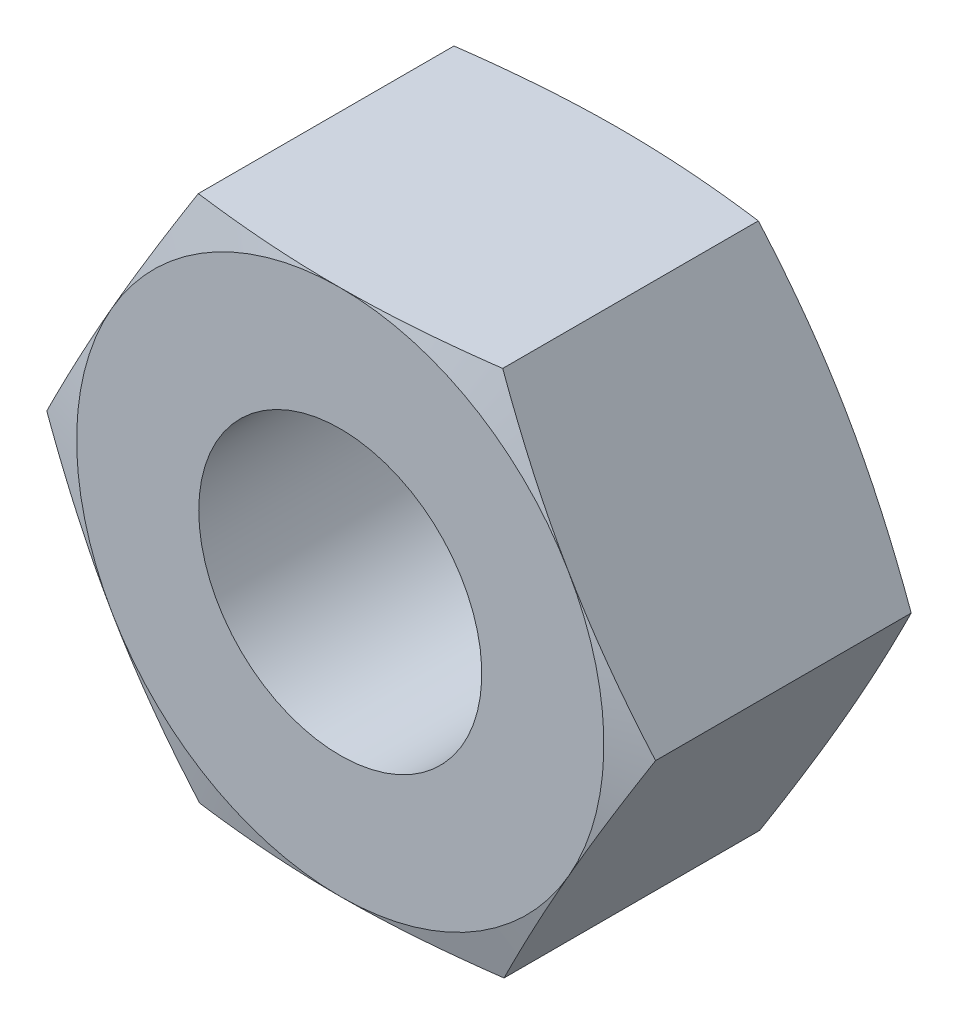
ISO-10303-21;
HEADER;
FILE_DESCRIPTION(('STEP AP214'),'2;1');
FILE_NAME('part.step','',(''),(''),'','','');
FILE_SCHEMA(('AUTOMOTIVE_DESIGN { 1 0 10303 214 1 1 1 1 }'));
ENDSEC;
DATA;
#1=APPLICATION_CONTEXT('core data for automotive mechanical design processes');
#2=APPLICATION_PROTOCOL_DEFINITION('international standard','automotive_design',2000,#1);
#3=PRODUCT_CONTEXT('',#1,'mechanical');
#4=PRODUCT('Part','Part','',(#3));
#5=PRODUCT_RELATED_PRODUCT_CATEGORY('part','',(#4));
#6=PRODUCT_DEFINITION_FORMATION('','',#4);
#7=PRODUCT_DEFINITION_CONTEXT('part definition',#1,'design');
#8=PRODUCT_DEFINITION('design','',#6,#7);
#9=PRODUCT_DEFINITION_SHAPE('','',#8);
#10=(LENGTH_UNIT() NAMED_UNIT(*) SI_UNIT(.MILLI.,.METRE.));
#11=(NAMED_UNIT(*) PLANE_ANGLE_UNIT() SI_UNIT($,.RADIAN.));
#12=(NAMED_UNIT(*) SI_UNIT($,.STERADIAN.) SOLID_ANGLE_UNIT());
#13=UNCERTAINTY_MEASURE_WITH_UNIT(LENGTH_MEASURE(1.E-05),#10,'distance_accuracy_value','');
#14=(GEOMETRIC_REPRESENTATION_CONTEXT(3) GLOBAL_UNCERTAINTY_ASSIGNED_CONTEXT((#13)) GLOBAL_UNIT_ASSIGNED_CONTEXT((#10,
#11,#12)) REPRESENTATION_CONTEXT('',''));
#15=CARTESIAN_POINT('',(0.,0.,0.));
#16=DIRECTION('',(0.,0.,1.));
#17=DIRECTION('',(1.,0.,0.));
#18=AXIS2_PLACEMENT_3D('',#15,#16,#17);
#19=CARTESIAN_POINT('',(0.,0.,0.));
#20=DIRECTION('',(0.,0.,1.));
#21=DIRECTION('',(1.,0.,0.));
#22=AXIS2_PLACEMENT_3D('',#19,#20,#21);
#23=PLANE('',#22);
#24=CARTESIAN_POINT('',(0.,0.,0.));
#25=DIRECTION('',(0.,0.,1.));
#26=DIRECTION('',(1.,0.,0.));
#27=AXIS2_PLACEMENT_3D('',#24,#25,#26);
#28=CIRCLE('',#27,9.5);
#29=CARTESIAN_POINT('',(8.21503441048256,4.77108055209586,0.));
#30=VERTEX_POINT('',#29);
#31=CARTESIAN_POINT('',(-0.0243597563756183,9.49996876848915,0.));
#32=VERTEX_POINT('',#31);
#33=EDGE_CURVE('E14',#30,#32,#28,.T.);
#34=ORIENTED_EDGE('',*,*,#33,.F.);
#35=CARTESIAN_POINT('',(8.23939416685818,-4.72888821639329,0.));
#36=VERTEX_POINT('',#35);
#37=EDGE_CURVE('E57',#36,#30,#28,.T.);
#38=ORIENTED_EDGE('',*,*,#37,.F.);
#39=CARTESIAN_POINT('',(0.0243597563756183,-9.49996876848915,0.));
#40=VERTEX_POINT('',#39);
#41=EDGE_CURVE('E164',#40,#36,#28,.T.);
#42=ORIENTED_EDGE('',*,*,#41,.F.);
#43=CARTESIAN_POINT('',(-8.21503441048256,-4.77108055209586,0.));
#44=VERTEX_POINT('',#43);
#45=EDGE_CURVE('E514',#44,#40,#28,.T.);
#46=ORIENTED_EDGE('',*,*,#45,.F.);
#47=CARTESIAN_POINT('',(-8.23939416685818,4.72888821639329,0.));
#48=VERTEX_POINT('',#47);
#49=EDGE_CURVE('E62',#48,#44,#28,.T.);
#50=ORIENTED_EDGE('',*,*,#49,.F.);
#51=CARTESIAN_POINT('',(0.,0.,0.));
#52=DIRECTION('',(0.,0.,-1.));
#53=DIRECTION('',(-1.,0.,0.));
#54=AXIS2_PLACEMENT_3D('',#51,#52,#53);
#55=CIRCLE('',#54,9.5);
#56=EDGE_CURVE('E168',#48,#32,#55,.T.);
#57=ORIENTED_EDGE('',*,*,#56,.T.);
#58=EDGE_LOOP('',(#34,#38,#42,#46,#50,#57));
#59=FACE_BOUND('',#58,.T.);
#60=CARTESIAN_POINT('',(0.,0.,0.));
#61=DIRECTION('',(0.,0.,-1.));
#62=DIRECTION('',(-1.,0.,0.));
#63=AXIS2_PLACEMENT_3D('',#60,#61,#62);
#64=CIRCLE('',#63,5.09999999999999);
#65=CARTESIAN_POINT('',(-5.09999999999999,0.,0.));
#66=VERTEX_POINT('',#65);
#67=EDGE_CURVE('E510',#66,#66,#64,.T.);
#68=ORIENTED_EDGE('',*,*,#67,.F.);
#69=EDGE_LOOP('',(#68));
#70=FACE_BOUND('',#69,.T.);
#71=ADVANCED_FACE('F52',(#59,#70),#23,.F.);
#72=CARTESIAN_POINT('',(10.9696190515605,0.0281282238017145,10.));
#73=DIRECTION('',(-0.864740464261323,-0.502219005483775,0.));
#74=DIRECTION('',(0.502219005483775,-0.864740464261323,0.));
#75=AXIS2_PLACEMENT_3D('',#72,#73,#74);
#76=PLANE('',#75);
#77=CARTESIAN_POINT('',(5.46033361455211,9.51423288039001,0.393823887682442));
#78=CARTESIAN_POINT('',(5.68912520853793,9.12029050257854,0.332765207818984));
#79=CARTESIAN_POINT('',(5.9183316212733,8.72563387350588,0.277334050263684));
#80=CARTESIAN_POINT('',(6.37755388773269,7.93492688798528,0.179946762141715));
#81=CARTESIAN_POINT('',(6.607570031986,7.53887603129256,0.137996104584147));
#82=CARTESIAN_POINT('',(7.06701720696994,6.74778178941605,0.0700188148540026));
#83=CARTESIAN_POINT('',(7.29644513107949,6.35274375333477,0.0439111187775036));
#84=CARTESIAN_POINT('',(7.75559355042798,5.5621639206783,0.00890337590082054));
#85=CARTESIAN_POINT('',(7.98531398045527,5.16662223638708,0.));
#86=CARTESIAN_POINT('',(8.44475484050986,4.37553886780465,0.));
#87=CARTESIAN_POINT('',(8.67447527053715,3.97999718351343,0.00890337590082028));
#88=CARTESIAN_POINT('',(9.13362368988564,3.18941735085696,0.0439111187775033));
#89=CARTESIAN_POINT('',(9.36305161399519,2.79437931477567,0.0700188148540024));
#90=CARTESIAN_POINT('',(9.82249878897913,2.00328507289916,0.137996104584146));
#91=CARTESIAN_POINT('',(10.0525149332324,1.60723421620644,0.179946762141714));
#92=CARTESIAN_POINT('',(10.5117371996918,0.816527230685846,0.277334050263684));
#93=CARTESIAN_POINT('',(10.7409436124272,0.421870601613182,0.332765207818983));
#94=CARTESIAN_POINT('',(10.969735206413,0.0279282238017149,0.393823887682442));
#95=B_SPLINE_CURVE_WITH_KNOTS('',3,(#77,#78,#79,#80,#81,#82,#83,#84,#85,#86,#87,#88,#89,#90,#91,
#92,#93,#94),.UNSPECIFIED.,.F.,.F.,(4,2,2,2,2,2,2,2,4),(0.,1.37897730781453,2.75851376758056,
4.13093067092312,5.5030819798307,6.87523328873828,8.24765019208084,9.62718665184686,
11.0061639596614),.UNSPECIFIED.);
#96=CARTESIAN_POINT('',(5.46044976940463,9.51403288039001,0.393792901110109));
#97=VERTEX_POINT('',#96);
#98=EDGE_CURVE('E142',#97,#30,#95,.T.);
#99=ORIENTED_EDGE('',*,*,#98,.F.);
#100=DIRECTION('',(0.,0.,-1.));
#101=VECTOR('',#100,1.);
#102=CARTESIAN_POINT('',(5.46044976940463,9.51403288039001,10.));
#103=LINE('',#102,#101);
#104=CARTESIAN_POINT('',(5.46044976940463,9.51403288039001,9.60620709888989));
#105=VERTEX_POINT('',#104);
#106=EDGE_CURVE('E349',#105,#97,#103,.T.);
#107=ORIENTED_EDGE('',*,*,#106,.F.);
#108=CARTESIAN_POINT('',(10.969735206413,0.0279282238017145,9.60617611231756));
#109=CARTESIAN_POINT('',(10.7409436124272,0.421870601613182,9.66723479218101));
#110=CARTESIAN_POINT('',(10.5117371996918,0.816527230685846,9.72266594973631));
#111=CARTESIAN_POINT('',(10.0525149332324,1.60723421620644,9.82005323785829));
#112=CARTESIAN_POINT('',(9.82249878897913,2.00328507289916,9.86200389541585));
#113=CARTESIAN_POINT('',(9.36305161399519,2.79437931477567,9.929981185146));
#114=CARTESIAN_POINT('',(9.13362368988564,3.18941735085696,9.9560888812225));
#115=CARTESIAN_POINT('',(8.67447527053715,3.97999718351343,9.99109662409918));
#116=CARTESIAN_POINT('',(8.44475484050986,4.37553886780464,10.));
#117=CARTESIAN_POINT('',(7.98531398045527,5.16662223638708,10.));
#118=CARTESIAN_POINT('',(7.75559355042798,5.5621639206783,9.99109662409918));
#119=CARTESIAN_POINT('',(7.2964451310795,6.35274375333477,9.9560888812225));
#120=CARTESIAN_POINT('',(7.06701720696994,6.74778178941605,9.929981185146));
#121=CARTESIAN_POINT('',(6.607570031986,7.53887603129256,9.86200389541585));
#122=CARTESIAN_POINT('',(6.37755388773269,7.93492688798528,9.82005323785829));
#123=CARTESIAN_POINT('',(5.9183316212733,8.72563387350588,9.72266594973631));
#124=CARTESIAN_POINT('',(5.68912520853793,9.12029050257854,9.66723479218101));
#125=CARTESIAN_POINT('',(5.46033361455211,9.51423288039001,9.60617611231756));
#126=B_SPLINE_CURVE_WITH_KNOTS('',3,(#108,#109,#110,#111,#112,#113,#114,#115,#116,#117,#118,
#119,#120,#121,#122,#123,#124,#125),.UNSPECIFIED.,.F.,.F.,(4,2,2,2,2,2,2,2,4),(0.,
1.37897730781453,2.75851376758056,4.13093067092312,5.5030819798307,6.87523328873828,
8.24765019208084,9.62718665184686,11.0061639596614),.UNSPECIFIED.);
#127=CARTESIAN_POINT('',(8.21503441048256,4.77108055209586,10.));
#128=VERTEX_POINT('',#127);
#129=EDGE_CURVE('E317',#128,#105,#126,.T.);
#130=ORIENTED_EDGE('',*,*,#129,.F.);
#131=CARTESIAN_POINT('',(10.9696190515605,0.028128223801714,9.60620709888989));
#132=VERTEX_POINT('',#131);
#133=EDGE_CURVE('E354',#132,#128,#126,.T.);
#134=ORIENTED_EDGE('',*,*,#133,.F.);
#135=DIRECTION('',(0.,0.,-1.));
#136=VECTOR('',#135,1.);
#137=CARTESIAN_POINT('',(10.9696190515605,0.0281282238017145,10.));
#138=LINE('',#137,#136);
#139=CARTESIAN_POINT('',(10.9696190515605,0.0281282238017144,0.393792901110109));
#140=VERTEX_POINT('',#139);
#141=EDGE_CURVE('E172',#132,#140,#138,.T.);
#142=ORIENTED_EDGE('',*,*,#141,.T.);
#143=EDGE_CURVE('E154',#30,#140,#95,.T.);
#144=ORIENTED_EDGE('',*,*,#143,.F.);
#145=EDGE_LOOP('',(#99,#107,#130,#134,#142,#144));
#146=FACE_BOUND('',#145,.T.);
#147=ADVANCED_FACE('F54',(#146),#76,.F.);
#148=CARTESIAN_POINT('',(5.46044976940463,9.51403288039001,10.));
#149=DIRECTION('',(0.00256418488164403,-0.999996712472543,0.));
#150=DIRECTION('',(0.999996712472543,0.00256418488164403,0.));
#151=AXIS2_PLACEMENT_3D('',#148,#149,#150);
#152=PLANE('',#151);
#153=CARTESIAN_POINT('',(-5.50936928215586,9.48590414374963,0.393819696483836));
#154=CARTESIAN_POINT('',(-5.05381196543143,9.48707228077418,0.332761623633344));
#155=CARTESIAN_POINT('',(-4.59742868932149,9.48824253571826,0.277331036000877));
#156=CARTESIAN_POINT('',(-3.68305043707248,9.49058717831686,0.179944772000762));
#157=CARTESIAN_POINT('',(-3.22505488246322,9.49176156745469,0.137994568487032));
#158=CARTESIAN_POINT('',(-2.31022880759083,9.49410735835706,0.0700180242904147));
#159=CARTESIAN_POINT('',(-1.85340447293939,9.4952787442605,0.0439106213232648));
#160=CARTESIAN_POINT('',(-0.939173257755987,9.49762300982764,0.00890327367649384));
#161=CARTESIAN_POINT('',(-0.481766507065802,9.4987958891584,0.));
#162=CARTESIAN_POINT('',(0.433046994314568,9.50114164781991,0.));
#163=CARTESIAN_POINT('',(0.890453745004753,9.50231452715066,0.00890327367649338));
#164=CARTESIAN_POINT('',(1.80468496018816,9.5046587927178,0.0439106213232645));
#165=CARTESIAN_POINT('',(2.2615092948396,9.50583017862124,0.0700180242904147));
#166=CARTESIAN_POINT('',(3.17633536971199,9.50817596952362,0.137994568487032));
#167=CARTESIAN_POINT('',(3.63433092432124,9.50935035866144,0.179944772000762));
#168=CARTESIAN_POINT('',(4.54870917657025,9.51169500126004,0.277331036000877));
#169=CARTESIAN_POINT('',(5.0050924526802,9.51286525620412,0.332761623633344));
#170=CARTESIAN_POINT('',(5.46064976940463,9.51403339322867,0.393819696483837));
#171=B_SPLINE_CURVE_WITH_KNOTS('',3,(#153,#154,#155,#156,#157,#158,#159,#160,#161,#162,#163,
#164,#165,#166,#167,#168,#169,#170),.UNSPECIFIED.,.F.,.F.,(4,2,2,2,2,2,2,2,4),(0.,
1.37896937137747,2.75849788045569,4.13090694474825,5.50305042145484,6.87519389816144,
8.24760296245399,9.62713147153221,11.0061008429097),.UNSPECIFIED.);
#172=CARTESIAN_POINT('',(-5.50916928215586,9.4859046565883,0.393792901110109));
#173=VERTEX_POINT('',#172);
#174=EDGE_CURVE('E69',#173,#32,#171,.T.);
#175=ORIENTED_EDGE('',*,*,#174,.F.);
#176=DIRECTION('',(0.,0.,-1.));
#177=VECTOR('',#176,1.);
#178=CARTESIAN_POINT('',(-5.50916928215586,9.4859046565883,10.));
#179=LINE('',#178,#177);
#180=CARTESIAN_POINT('',(-5.50916928215586,9.4859046565883,9.60620709888989));
#181=VERTEX_POINT('',#180);
#182=EDGE_CURVE('E313',#181,#173,#179,.T.);
#183=ORIENTED_EDGE('',*,*,#182,.F.);
#184=CARTESIAN_POINT('',(5.46064976940463,9.51403339322867,9.60618030351616));
#185=CARTESIAN_POINT('',(5.0050924526802,9.51286525620412,9.66723837636666));
#186=CARTESIAN_POINT('',(4.54870917657025,9.51169500126004,9.72266896399912));
#187=CARTESIAN_POINT('',(3.63433092432124,9.50935035866144,9.82005522799924));
#188=CARTESIAN_POINT('',(3.17633536971199,9.50817596952362,9.86200543151297));
#189=CARTESIAN_POINT('',(2.2615092948396,9.50583017862124,9.92998197570959));
#190=CARTESIAN_POINT('',(1.80468496018816,9.5046587927178,9.95608937867673));
#191=CARTESIAN_POINT('',(0.890453745004754,9.50231452715066,9.99109672632351));
#192=CARTESIAN_POINT('',(0.433046994314569,9.50114164781991,10.));
#193=CARTESIAN_POINT('',(-0.4817665070658,9.4987958891584,10.));
#194=CARTESIAN_POINT('',(-0.939173257755985,9.49762300982764,9.99109672632351));
#195=CARTESIAN_POINT('',(-1.85340447293939,9.4952787442605,9.95608937867673));
#196=CARTESIAN_POINT('',(-2.31022880759083,9.49410735835706,9.92998197570959));
#197=CARTESIAN_POINT('',(-3.22505488246322,9.49176156745469,9.86200543151297));
#198=CARTESIAN_POINT('',(-3.68305043707247,9.49058717831686,9.82005522799924));
#199=CARTESIAN_POINT('',(-4.59742868932148,9.48824253571826,9.72266896399912));
#200=CARTESIAN_POINT('',(-5.05381196543143,9.48707228077418,9.66723837636666));
#201=CARTESIAN_POINT('',(-5.50936928215586,9.48590414374963,9.60618030351616));
#202=B_SPLINE_CURVE_WITH_KNOTS('',3,(#184,#185,#186,#187,#188,#189,#190,#191,#192,#193,#194,
#195,#196,#197,#198,#199,#200,#201),.UNSPECIFIED.,.F.,.F.,(4,2,2,2,2,2,2,2,4),(0.,
1.37896937137747,2.75849788045569,4.13090694474825,5.50305042145484,6.87519389816143,
8.24760296245399,9.62713147153221,11.0061008429097),.UNSPECIFIED.);
#203=CARTESIAN_POINT('',(-0.0243597563756183,9.49996876848915,10.));
#204=VERTEX_POINT('',#203);
#205=EDGE_CURVE('E279',#204,#181,#202,.T.);
#206=ORIENTED_EDGE('',*,*,#205,.F.);
#207=EDGE_CURVE('E311',#105,#204,#202,.T.);
#208=ORIENTED_EDGE('',*,*,#207,.F.);
#209=ORIENTED_EDGE('',*,*,#106,.T.);
#210=EDGE_CURVE('E148',#32,#97,#171,.T.);
#211=ORIENTED_EDGE('',*,*,#210,.F.);
#212=EDGE_LOOP('',(#175,#183,#206,#208,#209,#211));
#213=FACE_BOUND('',#212,.T.);
#214=ADVANCED_FACE('F272',(#213),#152,.F.);
#215=CARTESIAN_POINT('',(-5.50916928215586,9.4859046565883,10.));
#216=DIRECTION('',(0.867304649142967,-0.497777706988767,0.));
#217=DIRECTION('',(0.497777706988767,0.867304649142967,0.));
#218=AXIS2_PLACEMENT_3D('',#215,#216,#217);
#219=PLANE('',#218);
#220=CARTESIAN_POINT('',(-10.9697338388403,-0.0283282238017159,0.393823796069243));
#221=CARTESIAN_POINT('',(-10.7429655571704,0.366782248622265,0.332765129474152));
#222=CARTESIAN_POINT('',(-10.5157861252442,0.762609090067524,0.277333984376491));
#223=CARTESIAN_POINT('',(-10.060624978832,1.55566063265393,0.179946718640257));
#224=CARTESIAN_POINT('',(-9.83264297638608,1.95288583552286,0.137996071007395));
#225=CARTESIAN_POINT('',(-9.37725891045376,2.7463257826791,0.0700187975734788));
#226=CARTESIAN_POINT('',(-9.14985992611375,3.14253516200539,0.0439111079039058));
#227=CARTESIAN_POINT('',(-8.69477197371195,3.93545917476344,0.00890337366635021));
#228=CARTESIAN_POINT('',(-8.46708307028507,4.33217369557836,0.));
#229=CARTESIAN_POINT('',(-8.0117052634313,5.12560273720822,0.));
#230=CARTESIAN_POINT('',(-7.78401636000441,5.52231725802314,0.00890337366634987));
#231=CARTESIAN_POINT('',(-7.32892840760261,6.31524127078119,0.0439111079039057));
#232=CARTESIAN_POINT('',(-7.1015294232626,6.71145065010747,0.070018797573479));
#233=CARTESIAN_POINT('',(-6.64614535733029,7.50489059726372,0.137996071007395));
#234=CARTESIAN_POINT('',(-6.4181633548844,7.90211580013265,0.179946718640258));
#235=CARTESIAN_POINT('',(-5.96300220847217,8.69516734271906,0.277333984376491));
#236=CARTESIAN_POINT('',(-5.735822776546,9.09099418416432,0.332765129474152));
#237=CARTESIAN_POINT('',(-5.50905449487611,9.48610465658829,0.393823796069243));
#238=B_SPLINE_CURVE_WITH_KNOTS('',3,(#220,#221,#222,#223,#224,#225,#226,#227,#228,#229,#230,
#231,#232,#233,#234,#235,#236,#237),.UNSPECIFIED.,.F.,.F.,(4,2,2,2,2,2,2,2,4),(0.,
1.3789771343365,2.75851342031298,4.13093015230624,5.50308129001423,6.87523242772223,
8.24764915971549,9.62718544569197,11.0061625800285),.UNSPECIFIED.);
#239=CARTESIAN_POINT('',(-10.9696190515605,-0.0281282238017158,0.393792901110108));
#240=VERTEX_POINT('',#239);
#241=EDGE_CURVE('E76',#240,#48,#238,.T.);
#242=ORIENTED_EDGE('',*,*,#241,.F.);
#243=DIRECTION('',(0.,0.,-1.));
#244=VECTOR('',#243,1.);
#245=CARTESIAN_POINT('',(-10.9696190515605,-0.0281282238017159,10.));
#246=LINE('',#245,#244);
#247=CARTESIAN_POINT('',(-10.9696190515605,-0.0281282238017158,9.60620709888989));
#248=VERTEX_POINT('',#247);
#249=EDGE_CURVE('E340',#248,#240,#246,.T.);
#250=ORIENTED_EDGE('',*,*,#249,.F.);
#251=CARTESIAN_POINT('',(-5.50905449487611,9.4861046565883,9.60617620393076));
#252=CARTESIAN_POINT('',(-5.735822776546,9.09099418416432,9.66723487052585));
#253=CARTESIAN_POINT('',(-5.96300220847217,8.69516734271906,9.72266601562351));
#254=CARTESIAN_POINT('',(-6.41816335488439,7.90211580013265,9.82005328135974));
#255=CARTESIAN_POINT('',(-6.64614535733029,7.50489059726372,9.86200392899261));
#256=CARTESIAN_POINT('',(-7.1015294232626,6.71145065010747,9.92998120242652));
#257=CARTESIAN_POINT('',(-7.32892840760261,6.31524127078119,9.95608889209609));
#258=CARTESIAN_POINT('',(-7.78401636000441,5.52231725802314,9.99109662633365));
#259=CARTESIAN_POINT('',(-8.0117052634313,5.12560273720822,10.));
#260=CARTESIAN_POINT('',(-8.46708307028507,4.33217369557836,10.));
#261=CARTESIAN_POINT('',(-8.69477197371195,3.93545917476344,9.99109662633365));
#262=CARTESIAN_POINT('',(-9.14985992611375,3.14253516200539,9.95608889209609));
#263=CARTESIAN_POINT('',(-9.37725891045376,2.74632578267911,9.92998120242652));
#264=CARTESIAN_POINT('',(-9.83264297638608,1.95288583552286,9.86200392899261));
#265=CARTESIAN_POINT('',(-10.060624978832,1.55566063265393,9.82005328135974));
#266=CARTESIAN_POINT('',(-10.5157861252442,0.762609090067524,9.72266601562351));
#267=CARTESIAN_POINT('',(-10.7429655571704,0.366782248622266,9.66723487052585));
#268=CARTESIAN_POINT('',(-10.9697338388403,-0.0283282238017155,9.60617620393076));
#269=B_SPLINE_CURVE_WITH_KNOTS('',3,(#251,#252,#253,#254,#255,#256,#257,#258,#259,#260,#261,
#262,#263,#264,#265,#266,#267,#268),.UNSPECIFIED.,.F.,.F.,(4,2,2,2,2,2,2,2,4),(0.,
1.3789771343365,2.75851342031298,4.13093015230624,5.50308129001424,6.87523242772223,
8.24764915971549,9.62718544569197,11.0061625800285),.UNSPECIFIED.);
#270=CARTESIAN_POINT('',(-8.23939416685818,4.72888821639329,10.));
#271=VERTEX_POINT('',#270);
#272=EDGE_CURVE('E258',#271,#248,#269,.T.);
#273=ORIENTED_EDGE('',*,*,#272,.F.);
#274=EDGE_CURVE('E316',#181,#271,#269,.T.);
#275=ORIENTED_EDGE('',*,*,#274,.F.);
#276=ORIENTED_EDGE('',*,*,#182,.T.);
#277=EDGE_CURVE('E209',#48,#173,#238,.T.);
#278=ORIENTED_EDGE('',*,*,#277,.F.);
#279=EDGE_LOOP('',(#242,#250,#273,#275,#276,#278));
#280=FACE_BOUND('',#279,.T.);
#281=ADVANCED_FACE('F267',(#280),#219,.F.);
#282=CARTESIAN_POINT('',(-10.9696190515605,-0.0281282238017159,10.));
#283=DIRECTION('',(0.864740464261323,0.502219005483775,0.));
#284=DIRECTION('',(-0.502219005483775,0.864740464261323,0.));
#285=AXIS2_PLACEMENT_3D('',#282,#283,#284);
#286=PLANE('',#285);
#287=CARTESIAN_POINT('',(-5.46033361455211,-9.51423288039001,0.393823887682442));
#288=CARTESIAN_POINT('',(-5.68912520853793,-9.12029050257854,0.332765207818984));
#289=CARTESIAN_POINT('',(-5.91833162127329,-8.72563387350588,0.277334050263685));
#290=CARTESIAN_POINT('',(-6.37755388773268,-7.93492688798528,0.179946762141715));
#291=CARTESIAN_POINT('',(-6.607570031986,-7.53887603129256,0.137996104584147));
#292=CARTESIAN_POINT('',(-7.06701720696994,-6.74778178941605,0.0700188148540019));
#293=CARTESIAN_POINT('',(-7.29644513107949,-6.35274375333477,0.0439111187775028));
#294=CARTESIAN_POINT('',(-7.75559355042798,-5.5621639206783,0.00890337590081993));
#295=CARTESIAN_POINT('',(-7.98531398045527,-5.16662223638708,0.));
#296=CARTESIAN_POINT('',(-8.44475484050986,-4.37553886780465,0.));
#297=CARTESIAN_POINT('',(-8.67447527053715,-3.97999718351343,0.00890337590081976));
#298=CARTESIAN_POINT('',(-9.13362368988563,-3.18941735085696,0.0439111187775028));
#299=CARTESIAN_POINT('',(-9.36305161399519,-2.79437931477567,0.070018814854002));
#300=CARTESIAN_POINT('',(-9.82249878897912,-2.00328507289916,0.137996104584146));
#301=CARTESIAN_POINT('',(-10.0525149332324,-1.60723421620644,0.179946762141714));
#302=CARTESIAN_POINT('',(-10.5117371996918,-0.816527230685845,0.277334050263684));
#303=CARTESIAN_POINT('',(-10.7409436124272,-0.421870601613181,0.332765207818983));
#304=CARTESIAN_POINT('',(-10.969735206413,-0.0279282238017141,0.393823887682441));
#305=B_SPLINE_CURVE_WITH_KNOTS('',3,(#287,#288,#289,#290,#291,#292,#293,#294,#295,#296,#297,
#298,#299,#300,#301,#302,#303,#304),.UNSPECIFIED.,.F.,.F.,(4,2,2,2,2,2,2,2,4),(0.,
1.37897730781453,2.75851376758056,4.13093067092312,5.5030819798307,6.87523328873828,
8.24765019208085,9.62718665184687,11.0061639596614),.UNSPECIFIED.);
#306=CARTESIAN_POINT('',(-5.46044976940463,-9.51403288039001,0.393792901110109));
#307=VERTEX_POINT('',#306);
#308=EDGE_CURVE('E187',#307,#44,#305,.T.);
#309=ORIENTED_EDGE('',*,*,#308,.F.);
#310=DIRECTION('',(0.,0.,-1.));
#311=VECTOR('',#310,1.);
#312=CARTESIAN_POINT('',(-5.46044976940463,-9.51403288039001,10.));
#313=LINE('',#312,#311);
#314=CARTESIAN_POINT('',(-5.46044976940463,-9.51403288039001,9.60620709888989));
#315=VERTEX_POINT('',#314);
#316=EDGE_CURVE('E337',#315,#307,#313,.T.);
#317=ORIENTED_EDGE('',*,*,#316,.F.);
#318=CARTESIAN_POINT('',(-10.969735206413,-0.0279282238017159,9.60617611231756));
#319=CARTESIAN_POINT('',(-10.7409436124272,-0.421870601613184,9.66723479218102));
#320=CARTESIAN_POINT('',(-10.5117371996918,-0.816527230685847,9.72266594973632));
#321=CARTESIAN_POINT('',(-10.0525149332324,-1.60723421620644,9.82005323785829));
#322=CARTESIAN_POINT('',(-9.82249878897912,-2.00328507289916,9.86200389541585));
#323=CARTESIAN_POINT('',(-9.36305161399519,-2.79437931477567,9.929981185146));
#324=CARTESIAN_POINT('',(-9.13362368988563,-3.18941735085696,9.9560888812225));
#325=CARTESIAN_POINT('',(-8.67447527053715,-3.97999718351343,9.99109662409918));
#326=CARTESIAN_POINT('',(-8.44475484050986,-4.37553886780465,10.));
#327=CARTESIAN_POINT('',(-7.98531398045527,-5.16662223638708,10.));
#328=CARTESIAN_POINT('',(-7.75559355042798,-5.5621639206783,9.99109662409918));
#329=CARTESIAN_POINT('',(-7.29644513107949,-6.35274375333477,9.9560888812225));
#330=CARTESIAN_POINT('',(-7.06701720696994,-6.74778178941605,9.929981185146));
#331=CARTESIAN_POINT('',(-6.607570031986,-7.53887603129256,9.86200389541585));
#332=CARTESIAN_POINT('',(-6.37755388773268,-7.93492688798528,9.82005323785829));
#333=CARTESIAN_POINT('',(-5.9183316212733,-8.72563387350588,9.72266594973631));
#334=CARTESIAN_POINT('',(-5.68912520853793,-9.12029050257854,9.66723479218101));
#335=CARTESIAN_POINT('',(-5.46033361455211,-9.51423288039001,9.60617611231756));
#336=B_SPLINE_CURVE_WITH_KNOTS('',3,(#318,#319,#320,#321,#322,#323,#324,#325,#326,#327,#328,
#329,#330,#331,#332,#333,#334,#335),.UNSPECIFIED.,.F.,.F.,(4,2,2,2,2,2,2,2,4),(0.,
1.37897730781454,2.75851376758056,4.13093067092312,5.5030819798307,6.87523328873828,
8.24765019208084,9.62718665184686,11.0061639596614),.UNSPECIFIED.);
#337=CARTESIAN_POINT('',(-8.21503441048256,-4.77108055209586,10.));
#338=VERTEX_POINT('',#337);
#339=EDGE_CURVE('E251',#338,#315,#336,.T.);
#340=ORIENTED_EDGE('',*,*,#339,.F.);
#341=EDGE_CURVE('E257',#248,#338,#336,.T.);
#342=ORIENTED_EDGE('',*,*,#341,.F.);
#343=ORIENTED_EDGE('',*,*,#249,.T.);
#344=EDGE_CURVE('E289',#44,#240,#305,.T.);
#345=ORIENTED_EDGE('',*,*,#344,.F.);
#346=EDGE_LOOP('',(#309,#317,#340,#342,#343,#345));
#347=FACE_BOUND('',#346,.T.);
#348=ADVANCED_FACE('F264',(#347),#286,.F.);
#349=CARTESIAN_POINT('',(-5.46044976940463,-9.51403288039001,10.));
#350=DIRECTION('',(-0.00256418488164403,0.999996712472543,0.));
#351=DIRECTION('',(-0.999996712472543,-0.00256418488164403,0.));
#352=AXIS2_PLACEMENT_3D('',#349,#350,#351);
#353=PLANE('',#352);
#354=CARTESIAN_POINT('',(5.50936928215587,-9.48590414374964,0.393819696483837));
#355=CARTESIAN_POINT('',(5.05381196543143,-9.48707228077418,0.332761623633345));
#356=CARTESIAN_POINT('',(4.59742868932149,-9.48824253571827,0.277331036000877));
#357=CARTESIAN_POINT('',(3.68305043707248,-9.49058717831686,0.179944772000762));
#358=CARTESIAN_POINT('',(3.22505488246322,-9.49176156745469,0.137994568487032));
#359=CARTESIAN_POINT('',(2.31022880759083,-9.49410735835706,0.070018024290415));
#360=CARTESIAN_POINT('',(1.8534044729394,-9.49527874426051,0.0439106213232648));
#361=CARTESIAN_POINT('',(0.93917325775599,-9.49762300982764,0.00890327367649386));
#362=CARTESIAN_POINT('',(0.481766507065805,-9.4987958891584,0.));
#363=CARTESIAN_POINT('',(-0.433046994314565,-9.50114164781991,0.));
#364=CARTESIAN_POINT('',(-0.89045374500475,-9.50231452715066,0.00890327367649398));
#365=CARTESIAN_POINT('',(-1.80468496018816,-9.5046587927178,0.0439106213232648));
#366=CARTESIAN_POINT('',(-2.26150929483959,-9.50583017862124,0.0700180242904149));
#367=CARTESIAN_POINT('',(-3.17633536971198,-9.50817596952362,0.137994568487032));
#368=CARTESIAN_POINT('',(-3.63433092432124,-9.50935035866144,0.179944772000762));
#369=CARTESIAN_POINT('',(-4.54870917657025,-9.51169500126004,0.277331036000877));
#370=CARTESIAN_POINT('',(-5.00509245268019,-9.51286525620412,0.332761623633344));
#371=CARTESIAN_POINT('',(-5.46064976940463,-9.51403339322867,0.393819696483836));
#372=B_SPLINE_CURVE_WITH_KNOTS('',3,(#354,#355,#356,#357,#358,#359,#360,#361,#362,#363,#364,
#365,#366,#367,#368,#369,#370,#371),.UNSPECIFIED.,.F.,.F.,(4,2,2,2,2,2,2,2,4),(0.,
1.37896937137747,2.75849788045569,4.13090694474825,5.50305042145484,6.87519389816143,
8.24760296245399,9.62713147153221,11.0061008429097),.UNSPECIFIED.);
#373=CARTESIAN_POINT('',(5.50916928215587,-9.4859046565883,0.393792901110109));
#374=VERTEX_POINT('',#373);
#375=EDGE_CURVE('E173',#374,#40,#372,.T.);
#376=ORIENTED_EDGE('',*,*,#375,.F.);
#377=DIRECTION('',(0.,0.,-1.));
#378=VECTOR('',#377,1.);
#379=CARTESIAN_POINT('',(5.50916928215587,-9.4859046565883,10.));
#380=LINE('',#379,#378);
#381=CARTESIAN_POINT('',(5.50916928215587,-9.4859046565883,9.60620709888989));
#382=VERTEX_POINT('',#381);
#383=EDGE_CURVE('E341',#382,#374,#380,.T.);
#384=ORIENTED_EDGE('',*,*,#383,.F.);
#385=CARTESIAN_POINT('',(-5.46064976940463,-9.51403339322867,9.60618030351616));
#386=CARTESIAN_POINT('',(-5.0050924526802,-9.51286525620412,9.66723837636666));
#387=CARTESIAN_POINT('',(-4.54870917657025,-9.51169500126004,9.72266896399912));
#388=CARTESIAN_POINT('',(-3.63433092432124,-9.50935035866144,9.82005522799924));
#389=CARTESIAN_POINT('',(-3.17633536971199,-9.50817596952362,9.86200543151297));
#390=CARTESIAN_POINT('',(-2.2615092948396,-9.50583017862124,9.92998197570959));
#391=CARTESIAN_POINT('',(-1.80468496018816,-9.5046587927178,9.95608937867673));
#392=CARTESIAN_POINT('',(-0.890453745004753,-9.50231452715066,9.99109672632351));
#393=CARTESIAN_POINT('',(-0.433046994314568,-9.50114164781991,10.));
#394=CARTESIAN_POINT('',(0.481766507065802,-9.4987958891584,10.));
#395=CARTESIAN_POINT('',(0.939173257755987,-9.49762300982764,9.99109672632351));
#396=CARTESIAN_POINT('',(1.85340447293939,-9.49527874426051,9.95608937867673));
#397=CARTESIAN_POINT('',(2.31022880759083,-9.49410735835706,9.92998197570959));
#398=CARTESIAN_POINT('',(3.22505488246322,-9.49176156745469,9.86200543151297));
#399=CARTESIAN_POINT('',(3.68305043707247,-9.49058717831686,9.82005522799924));
#400=CARTESIAN_POINT('',(4.59742868932148,-9.48824253571827,9.72266896399912));
#401=CARTESIAN_POINT('',(5.05381196543143,-9.48707228077418,9.66723837636666));
#402=CARTESIAN_POINT('',(5.50936928215586,-9.48590414374964,9.60618030351616));
#403=B_SPLINE_CURVE_WITH_KNOTS('',3,(#385,#386,#387,#388,#389,#390,#391,#392,#393,#394,#395,
#396,#397,#398,#399,#400,#401,#402),.UNSPECIFIED.,.F.,.F.,(4,2,2,2,2,2,2,2,4),(0.,
1.37896937137747,2.75849788045569,4.13090694474825,5.50305042145484,6.87519389816143,
8.24760296245399,9.62713147153221,11.0061008429097),.UNSPECIFIED.);
#404=CARTESIAN_POINT('',(0.0243597563756183,-9.49996876848915,10.));
#405=VERTEX_POINT('',#404);
#406=EDGE_CURVE('E244',#405,#382,#403,.T.);
#407=ORIENTED_EDGE('',*,*,#406,.F.);
#408=EDGE_CURVE('E250',#315,#405,#403,.T.);
#409=ORIENTED_EDGE('',*,*,#408,.F.);
#410=ORIENTED_EDGE('',*,*,#316,.T.);
#411=EDGE_CURVE('E153',#40,#307,#372,.T.);
#412=ORIENTED_EDGE('',*,*,#411,.F.);
#413=EDGE_LOOP('',(#376,#384,#407,#409,#410,#412));
#414=FACE_BOUND('',#413,.T.);
#415=ADVANCED_FACE('F231',(#414),#353,.F.);
#416=CARTESIAN_POINT('',(5.50916928215587,-9.4859046565883,10.));
#417=DIRECTION('',(-0.867304649142967,0.497777706988768,0.));
#418=DIRECTION('',(-0.497777706988768,-0.867304649142967,0.));
#419=AXIS2_PLACEMENT_3D('',#416,#417,#418);
#420=PLANE('',#419);
#421=CARTESIAN_POINT('',(10.9697338388403,0.0283282238017145,0.393823796069244));
#422=CARTESIAN_POINT('',(10.7429655571704,-0.366782248622266,0.332765129474153));
#423=CARTESIAN_POINT('',(10.5157861252442,-0.762609090067525,0.277333984376492));
#424=CARTESIAN_POINT('',(10.060624978832,-1.55566063265393,0.179946718640258));
#425=CARTESIAN_POINT('',(9.83264297638608,-1.95288583552286,0.137996071007396));
#426=CARTESIAN_POINT('',(9.37725891045376,-2.74632578267911,0.07001879757348));
#427=CARTESIAN_POINT('',(9.14985992611375,-3.14253516200539,0.0439111079039069));
#428=CARTESIAN_POINT('',(8.69477197371195,-3.93545917476344,0.00890337366635095));
#429=CARTESIAN_POINT('',(8.46708307028507,-4.33217369557836,0.));
#430=CARTESIAN_POINT('',(8.0117052634313,-5.12560273720822,0.));
#431=CARTESIAN_POINT('',(7.78401636000441,-5.52231725802315,0.00890337366635081));
#432=CARTESIAN_POINT('',(7.32892840760262,-6.31524127078119,0.0439111079039066));
#433=CARTESIAN_POINT('',(7.1015294232626,-6.71145065010748,0.0700187975734797));
#434=CARTESIAN_POINT('',(6.64614535733029,-7.50489059726372,0.137996071007396));
#435=CARTESIAN_POINT('',(6.4181633548844,-7.90211580013265,0.179946718640258));
#436=CARTESIAN_POINT('',(5.96300220847217,-8.69516734271906,0.277333984376492));
#437=CARTESIAN_POINT('',(5.735822776546,-9.09099418416432,0.332765129474153));
#438=CARTESIAN_POINT('',(5.50905449487611,-9.4861046565883,0.393823796069243));
#439=B_SPLINE_CURVE_WITH_KNOTS('',3,(#421,#422,#423,#424,#425,#426,#427,#428,#429,#430,#431,
#432,#433,#434,#435,#436,#437,#438),.UNSPECIFIED.,.F.,.F.,(4,2,2,2,2,2,2,2,4),(0.,
1.3789771343365,2.75851342031298,4.13093015230625,5.50308129001424,6.87523242772223,
8.24764915971549,9.62718544569197,11.0061625800285),.UNSPECIFIED.);
#440=EDGE_CURVE('E160',#140,#36,#439,.T.);
#441=ORIENTED_EDGE('',*,*,#440,.F.);
#442=ORIENTED_EDGE('',*,*,#141,.F.);
#443=CARTESIAN_POINT('',(5.50905449487611,-9.4861046565883,9.60617620393076));
#444=CARTESIAN_POINT('',(5.735822776546,-9.09099418416432,9.66723487052585));
#445=CARTESIAN_POINT('',(5.96300220847217,-8.69516734271906,9.72266601562351));
#446=CARTESIAN_POINT('',(6.4181633548844,-7.90211580013265,9.82005328135974));
#447=CARTESIAN_POINT('',(6.64614535733029,-7.50489059726372,9.8620039289926));
#448=CARTESIAN_POINT('',(7.1015294232626,-6.71145065010748,9.92998120242652));
#449=CARTESIAN_POINT('',(7.32892840760262,-6.31524127078119,9.95608889209609));
#450=CARTESIAN_POINT('',(7.78401636000441,-5.52231725802315,9.99109662633365));
#451=CARTESIAN_POINT('',(8.0117052634313,-5.12560273720822,10.));
#452=CARTESIAN_POINT('',(8.46708307028507,-4.33217369557836,10.));
#453=CARTESIAN_POINT('',(8.69477197371195,-3.93545917476344,9.99109662633365));
#454=CARTESIAN_POINT('',(9.14985992611375,-3.14253516200539,9.95608889209609));
#455=CARTESIAN_POINT('',(9.37725891045376,-2.74632578267911,9.92998120242652));
#456=CARTESIAN_POINT('',(9.83264297638608,-1.95288583552286,9.8620039289926));
#457=CARTESIAN_POINT('',(10.060624978832,-1.55566063265393,9.82005328135974));
#458=CARTESIAN_POINT('',(10.5157861252442,-0.762609090067523,9.72266601562351));
#459=CARTESIAN_POINT('',(10.7429655571704,-0.366782248622264,9.66723487052585));
#460=CARTESIAN_POINT('',(10.9697338388403,0.0283282238017161,9.60617620393076));
#461=B_SPLINE_CURVE_WITH_KNOTS('',3,(#443,#444,#445,#446,#447,#448,#449,#450,#451,#452,#453,
#454,#455,#456,#457,#458,#459,#460),.UNSPECIFIED.,.F.,.F.,(4,2,2,2,2,2,2,2,4),(0.,
1.3789771343365,2.75851342031298,4.13093015230625,5.50308129001424,6.87523242772223,
8.24764915971549,9.62718544569198,11.0061625800285),.UNSPECIFIED.);
#462=CARTESIAN_POINT('',(8.23939416685818,-4.72888821639329,10.));
#463=VERTEX_POINT('',#462);
#464=EDGE_CURVE('E236',#463,#132,#461,.T.);
#465=ORIENTED_EDGE('',*,*,#464,.F.);
#466=EDGE_CURVE('E242',#382,#463,#461,.T.);
#467=ORIENTED_EDGE('',*,*,#466,.F.);
#468=ORIENTED_EDGE('',*,*,#383,.T.);
#469=EDGE_CURVE('E218',#36,#374,#439,.T.);
#470=ORIENTED_EDGE('',*,*,#469,.F.);
#471=EDGE_LOOP('',(#441,#442,#465,#467,#468,#470));
#472=FACE_BOUND('',#471,.T.);
#473=ADVANCED_FACE('F227',(#472),#420,.F.);
#474=CARTESIAN_POINT('',(0.,0.,10.));
#475=DIRECTION('',(0.,0.,-1.));
#476=DIRECTION('',(1.,0.,0.));
#477=AXIS2_PLACEMENT_3D('',#474,#475,#476);
#478=CONICAL_SURFACE('',#477,9.5,1.30899693899575);
#479=ORIENTED_EDGE('',*,*,#133,.T.);
#480=CARTESIAN_POINT('',(0.,0.,10.));
#481=DIRECTION('',(0.,0.,1.));
#482=DIRECTION('',(1.,0.,0.));
#483=AXIS2_PLACEMENT_3D('',#480,#481,#482);
#484=CIRCLE('',#483,9.5);
#485=EDGE_CURVE('E305',#463,#128,#484,.T.);
#486=ORIENTED_EDGE('',*,*,#485,.F.);
#487=ORIENTED_EDGE('',*,*,#464,.T.);
#488=EDGE_LOOP('',(#479,#486,#487));
#489=FACE_BOUND('',#488,.T.);
#490=ADVANCED_FACE('F203',(#489),#478,.T.);
#491=ORIENTED_EDGE('',*,*,#406,.T.);
#492=ORIENTED_EDGE('',*,*,#466,.T.);
#493=EDGE_CURVE('E334',#405,#463,#484,.T.);
#494=ORIENTED_EDGE('',*,*,#493,.F.);
#495=EDGE_LOOP('',(#491,#492,#494));
#496=FACE_BOUND('',#495,.T.);
#497=ADVANCED_FACE('F356',(#496),#478,.T.);
#498=ORIENTED_EDGE('',*,*,#339,.T.);
#499=ORIENTED_EDGE('',*,*,#408,.T.);
#500=EDGE_CURVE('E329',#338,#405,#484,.T.);
#501=ORIENTED_EDGE('',*,*,#500,.F.);
#502=EDGE_LOOP('',(#498,#499,#501));
#503=FACE_BOUND('',#502,.T.);
#504=ADVANCED_FACE('F330',(#503),#478,.T.);
#505=ORIENTED_EDGE('',*,*,#272,.T.);
#506=ORIENTED_EDGE('',*,*,#341,.T.);
#507=EDGE_CURVE('E323',#271,#338,#484,.T.);
#508=ORIENTED_EDGE('',*,*,#507,.F.);
#509=EDGE_LOOP('',(#505,#506,#508));
#510=FACE_BOUND('',#509,.T.);
#511=ADVANCED_FACE('F322',(#510),#478,.T.);
#512=ORIENTED_EDGE('',*,*,#205,.T.);
#513=ORIENTED_EDGE('',*,*,#274,.T.);
#514=EDGE_CURVE('E165',#204,#271,#484,.T.);
#515=ORIENTED_EDGE('',*,*,#514,.F.);
#516=EDGE_LOOP('',(#512,#513,#515));
#517=FACE_BOUND('',#516,.T.);
#518=ADVANCED_FACE('F364',(#517),#478,.T.);
#519=ORIENTED_EDGE('',*,*,#129,.T.);
#520=ORIENTED_EDGE('',*,*,#207,.T.);
#521=CARTESIAN_POINT('',(0.,0.,10.));
#522=DIRECTION('',(0.,0.,1.));
#523=DIRECTION('',(1.,0.,0.));
#524=AXIS2_PLACEMENT_3D('',#521,#522,#523);
#525=CIRCLE('',#524,9.5);
#526=EDGE_CURVE('E243',#128,#204,#525,.T.);
#527=ORIENTED_EDGE('',*,*,#526,.F.);
#528=EDGE_LOOP('',(#519,#520,#527));
#529=FACE_BOUND('',#528,.T.);
#530=ADVANCED_FACE('F363',(#529),#478,.T.);
#531=CARTESIAN_POINT('',(0.,0.,10.));
#532=DIRECTION('',(0.,0.,1.));
#533=DIRECTION('',(1.,0.,0.));
#534=AXIS2_PLACEMENT_3D('',#531,#532,#533);
#535=PLANE('',#534);
#536=CARTESIAN_POINT('',(0.,0.,10.));
#537=DIRECTION('',(0.,0.,-1.));
#538=DIRECTION('',(-1.,0.,0.));
#539=AXIS2_PLACEMENT_3D('',#536,#537,#538);
#540=CIRCLE('',#539,5.09999999999999);
#541=CARTESIAN_POINT('',(-5.09999999999999,0.,10.));
#542=VERTEX_POINT('',#541);
#543=EDGE_CURVE('E507',#542,#542,#540,.T.);
#544=ORIENTED_EDGE('',*,*,#543,.T.);
#545=EDGE_LOOP('',(#544));
#546=FACE_BOUND('',#545,.T.);
#547=ORIENTED_EDGE('',*,*,#485,.T.);
#548=ORIENTED_EDGE('',*,*,#526,.T.);
#549=ORIENTED_EDGE('',*,*,#514,.T.);
#550=ORIENTED_EDGE('',*,*,#507,.T.);
#551=ORIENTED_EDGE('',*,*,#500,.T.);
#552=ORIENTED_EDGE('',*,*,#493,.T.);
#553=EDGE_LOOP('',(#547,#548,#549,#550,#551,#552));
#554=FACE_BOUND('',#553,.T.);
#555=ADVANCED_FACE('F300',(#546,#554),#535,.T.);
#556=CARTESIAN_POINT('',(0.,0.,0.));
#557=DIRECTION('',(0.,0.,1.));
#558=DIRECTION('',(-1.,0.,0.));
#559=AXIS2_PLACEMENT_3D('',#556,#557,#558);
#560=CONICAL_SURFACE('',#559,9.5,1.30899693899575);
#561=ORIENTED_EDGE('',*,*,#143,.T.);
#562=ORIENTED_EDGE('',*,*,#440,.T.);
#563=ORIENTED_EDGE('',*,*,#37,.T.);
#564=EDGE_LOOP('',(#561,#562,#563));
#565=FACE_BOUND('',#564,.T.);
#566=ADVANCED_FACE('F158',(#565),#560,.T.);
#567=ORIENTED_EDGE('',*,*,#375,.T.);
#568=ORIENTED_EDGE('',*,*,#41,.T.);
#569=ORIENTED_EDGE('',*,*,#469,.T.);
#570=EDGE_LOOP('',(#567,#568,#569));
#571=FACE_BOUND('',#570,.T.);
#572=ADVANCED_FACE('F201',(#571),#560,.T.);
#573=ORIENTED_EDGE('',*,*,#308,.T.);
#574=ORIENTED_EDGE('',*,*,#45,.T.);
#575=ORIENTED_EDGE('',*,*,#411,.T.);
#576=EDGE_LOOP('',(#573,#574,#575));
#577=FACE_BOUND('',#576,.T.);
#578=ADVANCED_FACE('F200',(#577),#560,.T.);
#579=ORIENTED_EDGE('',*,*,#241,.T.);
#580=ORIENTED_EDGE('',*,*,#49,.T.);
#581=ORIENTED_EDGE('',*,*,#344,.T.);
#582=EDGE_LOOP('',(#579,#580,#581));
#583=FACE_BOUND('',#582,.T.);
#584=ADVANCED_FACE('F194',(#583),#560,.T.);
#585=ORIENTED_EDGE('',*,*,#277,.T.);
#586=ORIENTED_EDGE('',*,*,#174,.T.);
#587=ORIENTED_EDGE('',*,*,#56,.F.);
#588=EDGE_LOOP('',(#585,#586,#587));
#589=FACE_BOUND('',#588,.T.);
#590=ADVANCED_FACE('F199',(#589),#560,.T.);
#591=ORIENTED_EDGE('',*,*,#210,.T.);
#592=ORIENTED_EDGE('',*,*,#98,.T.);
#593=ORIENTED_EDGE('',*,*,#33,.T.);
#594=EDGE_LOOP('',(#591,#592,#593));
#595=FACE_BOUND('',#594,.T.);
#596=ADVANCED_FACE('F144',(#595),#560,.T.);
#597=CARTESIAN_POINT('',(0.,0.,0.));
#598=DIRECTION('',(0.,0.,-1.));
#599=DIRECTION('',(-1.,0.,0.));
#600=AXIS2_PLACEMENT_3D('',#597,#598,#599);
#601=CYLINDRICAL_SURFACE('',#600,5.09999999999999);
#602=ORIENTED_EDGE('',*,*,#543,.F.);
#603=EDGE_LOOP('',(#602));
#604=FACE_BOUND('',#603,.T.);
#605=ORIENTED_EDGE('',*,*,#67,.T.);
#606=EDGE_LOOP('',(#605));
#607=FACE_BOUND('',#606,.T.);
#608=ADVANCED_FACE('F202',(#604,#607),#601,.F.);
#609=CLOSED_SHELL('',(#71,#147,#214,#281,#348,#415,#473,#490,#497,#504,#511,#518,#530,#555,#566,
#572,#578,#584,#590,#596,#608));
#610=MANIFOLD_SOLID_BREP('B2',#609);
#611=ADVANCED_BREP_SHAPE_REPRESENTATION('',(#18,#610),#14);
#612=SHAPE_DEFINITION_REPRESENTATION(#9,#611);
ENDSEC;
END-ISO-10303-21;
